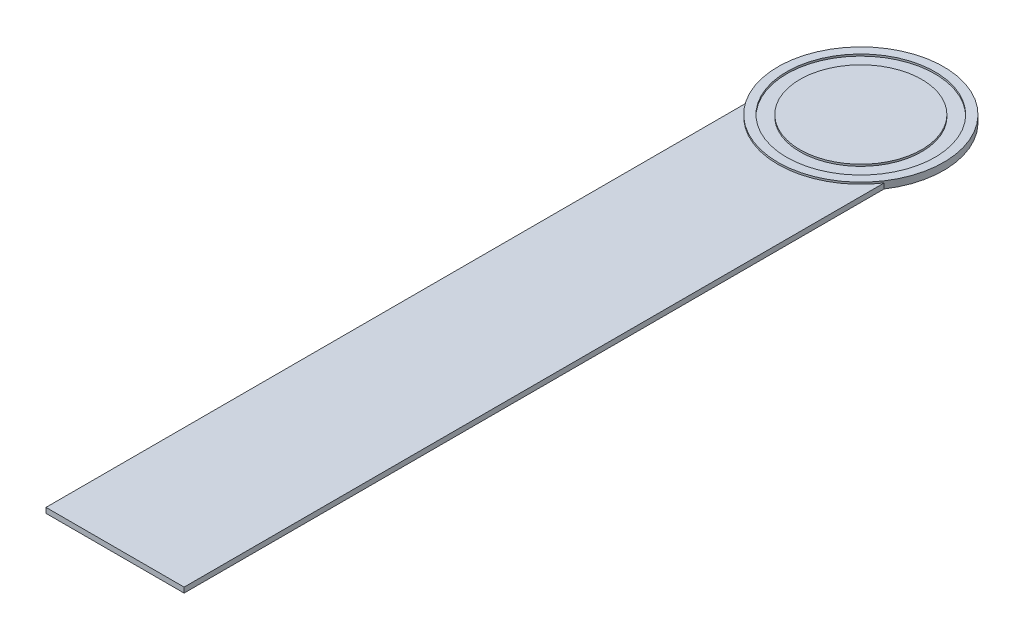
ISO-10303-21;
HEADER;
FILE_DESCRIPTION(('STEP AP214'),'2;1');
FILE_NAME('part.step','',(''),(''),'','','');
FILE_SCHEMA(('AUTOMOTIVE_DESIGN { 1 0 10303 214 1 1 1 1 }'));
ENDSEC;
DATA;
#1=APPLICATION_CONTEXT('core data for automotive mechanical design processes');
#2=APPLICATION_PROTOCOL_DEFINITION('international standard','automotive_design',2000,#1);
#3=PRODUCT_CONTEXT('',#1,'mechanical');
#4=PRODUCT('Part','Part','',(#3));
#5=PRODUCT_RELATED_PRODUCT_CATEGORY('part','',(#4));
#6=PRODUCT_DEFINITION_FORMATION('','',#4);
#7=PRODUCT_DEFINITION_CONTEXT('part definition',#1,'design');
#8=PRODUCT_DEFINITION('design','',#6,#7);
#9=PRODUCT_DEFINITION_SHAPE('','',#8);
#10=(LENGTH_UNIT() NAMED_UNIT(*) SI_UNIT(.MILLI.,.METRE.));
#11=(NAMED_UNIT(*) PLANE_ANGLE_UNIT() SI_UNIT($,.RADIAN.));
#12=(NAMED_UNIT(*) SI_UNIT($,.STERADIAN.) SOLID_ANGLE_UNIT());
#13=UNCERTAINTY_MEASURE_WITH_UNIT(LENGTH_MEASURE(1.E-05),#10,'distance_accuracy_value','');
#14=(GEOMETRIC_REPRESENTATION_CONTEXT(3) GLOBAL_UNCERTAINTY_ASSIGNED_CONTEXT((#13)) GLOBAL_UNIT_ASSIGNED_CONTEXT((#10,
#11,#12)) REPRESENTATION_CONTEXT('',''));
#15=CARTESIAN_POINT('',(0.,0.,0.));
#16=DIRECTION('',(0.,0.,1.));
#17=DIRECTION('',(1.,0.,0.));
#18=AXIS2_PLACEMENT_3D('',#15,#16,#17);
#19=CARTESIAN_POINT('',(0.,0.325,0.));
#20=DIRECTION('',(0.,-1.,0.));
#21=DIRECTION('',(0.,0.,-1.));
#22=AXIS2_PLACEMENT_3D('',#19,#20,#21);
#23=CYLINDRICAL_SURFACE('',#22,2.8);
#24=CARTESIAN_POINT('',(0.,0.24,0.));
#25=DIRECTION('',(0.,1.,0.));
#26=DIRECTION('',(0.,0.,1.));
#27=AXIS2_PLACEMENT_3D('',#24,#25,#26);
#28=CIRCLE('',#27,2.8);
#29=CARTESIAN_POINT('',(0.,0.24,2.8));
#30=VERTEX_POINT('',#29);
#31=EDGE_CURVE('E71',#30,#30,#28,.T.);
#32=ORIENTED_EDGE('',*,*,#31,.T.);
#33=EDGE_LOOP('',(#32));
#34=FACE_BOUND('',#33,.T.);
#35=CARTESIAN_POINT('',(0.,0.325,0.));
#36=DIRECTION('',(0.,1.,0.));
#37=DIRECTION('',(0.,0.,1.));
#38=AXIS2_PLACEMENT_3D('',#35,#36,#37);
#39=CIRCLE('',#38,2.8);
#40=CARTESIAN_POINT('',(0.,0.325,2.8));
#41=VERTEX_POINT('',#40);
#42=EDGE_CURVE('E12',#41,#41,#39,.T.);
#43=ORIENTED_EDGE('',*,*,#42,.F.);
#44=EDGE_LOOP('',(#43));
#45=FACE_BOUND('',#44,.T.);
#46=ADVANCED_FACE('F64',(#34,#45),#23,.T.);
#47=CARTESIAN_POINT('',(0.,0.325,0.));
#48=DIRECTION('',(0.,1.,0.));
#49=DIRECTION('',(0.,0.,1.));
#50=AXIS2_PLACEMENT_3D('',#47,#48,#49);
#51=PLANE('',#50);
#52=ORIENTED_EDGE('',*,*,#42,.T.);
#53=EDGE_LOOP('',(#52));
#54=FACE_BOUND('',#53,.T.);
#55=ADVANCED_FACE('F156',(#54),#51,.T.);
#56=CARTESIAN_POINT('',(0.,0.24,0.));
#57=DIRECTION('',(0.,1.,0.));
#58=DIRECTION('',(0.,0.,1.));
#59=AXIS2_PLACEMENT_3D('',#56,#57,#58);
#60=PLANE('',#59);
#61=CARTESIAN_POINT('',(0.,0.24,0.));
#62=DIRECTION('',(0.,1.,0.));
#63=DIRECTION('',(0.,0.,1.));
#64=AXIS2_PLACEMENT_3D('',#61,#62,#63);
#65=CIRCLE('',#64,3.41);
#66=CARTESIAN_POINT('',(0.,0.24,3.41));
#67=VERTEX_POINT('',#66);
#68=EDGE_CURVE('E145',#67,#67,#65,.F.);
#69=ORIENTED_EDGE('',*,*,#68,.F.);
#70=EDGE_LOOP('',(#69));
#71=FACE_BOUND('',#70,.T.);
#72=ORIENTED_EDGE('',*,*,#31,.F.);
#73=EDGE_LOOP('',(#72));
#74=FACE_BOUND('',#73,.T.);
#75=ADVANCED_FACE('F153',(#71,#74),#60,.T.);
#76=CARTESIAN_POINT('',(0.,0.325,0.));
#77=DIRECTION('',(0.,-1.,0.));
#78=DIRECTION('',(0.,0.,-1.));
#79=AXIS2_PLACEMENT_3D('',#76,#77,#78);
#80=CYLINDRICAL_SURFACE('',#79,3.81);
#81=CARTESIAN_POINT('',(0.,0.24,0.));
#82=DIRECTION('',(0.,1.,0.));
#83=DIRECTION('',(0.,0.,1.));
#84=AXIS2_PLACEMENT_3D('',#81,#82,#83);
#85=CIRCLE('',#84,3.81);
#86=CARTESIAN_POINT('',(-3.175,0.24,2.10605674187568));
#87=VERTEX_POINT('',#86);
#88=CARTESIAN_POINT('',(3.175,0.24,2.10605674187568));
#89=VERTEX_POINT('',#88);
#90=EDGE_CURVE('E78',#87,#89,#85,.T.);
#91=ORIENTED_EDGE('',*,*,#90,.T.);
#92=DIRECTION('',(0.,-1.,0.));
#93=VECTOR('',#92,1.);
#94=CARTESIAN_POINT('',(3.175,0.24,2.10605674187568));
#95=LINE('',#94,#93);
#96=CARTESIAN_POINT('',(3.175,0.,2.10605674187568));
#97=VERTEX_POINT('',#96);
#98=EDGE_CURVE('E115',#89,#97,#95,.T.);
#99=ORIENTED_EDGE('',*,*,#98,.T.);
#100=CARTESIAN_POINT('',(0.,0.,0.));
#101=DIRECTION('',(0.,1.,0.));
#102=DIRECTION('',(0.,0.,1.));
#103=AXIS2_PLACEMENT_3D('',#100,#101,#102);
#104=CIRCLE('',#103,3.81);
#105=CARTESIAN_POINT('',(-3.175,0.,2.10605674187568));
#106=VERTEX_POINT('',#105);
#107=EDGE_CURVE('E114',#97,#106,#104,.T.);
#108=ORIENTED_EDGE('',*,*,#107,.T.);
#109=DIRECTION('',(0.,-1.,0.));
#110=VECTOR('',#109,1.);
#111=CARTESIAN_POINT('',(-3.175,0.24,2.10605674187568));
#112=LINE('',#111,#110);
#113=EDGE_CURVE('E83',#87,#106,#112,.T.);
#114=ORIENTED_EDGE('',*,*,#113,.F.);
#115=EDGE_LOOP('',(#91,#99,#108,#114));
#116=FACE_BOUND('',#115,.T.);
#117=CARTESIAN_POINT('',(0.,0.325,0.));
#118=DIRECTION('',(0.,1.,0.));
#119=DIRECTION('',(0.,0.,1.));
#120=AXIS2_PLACEMENT_3D('',#117,#118,#119);
#121=CIRCLE('',#120,3.81);
#122=CARTESIAN_POINT('',(0.,0.325,3.81));
#123=VERTEX_POINT('',#122);
#124=EDGE_CURVE('E139',#123,#123,#121,.T.);
#125=ORIENTED_EDGE('',*,*,#124,.F.);
#126=EDGE_LOOP('',(#125));
#127=FACE_BOUND('',#126,.T.);
#128=ADVANCED_FACE('F155',(#116,#127),#80,.T.);
#129=CARTESIAN_POINT('',(0.,0.325,0.));
#130=DIRECTION('',(0.,-1.,0.));
#131=DIRECTION('',(0.,0.,-1.));
#132=AXIS2_PLACEMENT_3D('',#129,#130,#131);
#133=CYLINDRICAL_SURFACE('',#132,3.41);
#134=ORIENTED_EDGE('',*,*,#68,.T.);
#135=EDGE_LOOP('',(#134));
#136=FACE_BOUND('',#135,.T.);
#137=CARTESIAN_POINT('',(0.,0.325,0.));
#138=DIRECTION('',(0.,1.,0.));
#139=DIRECTION('',(0.,0.,1.));
#140=AXIS2_PLACEMENT_3D('',#137,#138,#139);
#141=CIRCLE('',#140,3.41);
#142=CARTESIAN_POINT('',(0.,0.325,3.41));
#143=VERTEX_POINT('',#142);
#144=EDGE_CURVE('E142',#143,#143,#141,.T.);
#145=ORIENTED_EDGE('',*,*,#144,.T.);
#146=EDGE_LOOP('',(#145));
#147=FACE_BOUND('',#146,.T.);
#148=ADVANCED_FACE('F163',(#136,#147),#133,.F.);
#149=CARTESIAN_POINT('',(0.,0.325,0.));
#150=DIRECTION('',(0.,1.,0.));
#151=DIRECTION('',(0.,0.,1.));
#152=AXIS2_PLACEMENT_3D('',#149,#150,#151);
#153=PLANE('',#152);
#154=ORIENTED_EDGE('',*,*,#124,.T.);
#155=EDGE_LOOP('',(#154));
#156=FACE_BOUND('',#155,.T.);
#157=ORIENTED_EDGE('',*,*,#144,.F.);
#158=EDGE_LOOP('',(#157));
#159=FACE_BOUND('',#158,.T.);
#160=ADVANCED_FACE('F188',(#156,#159),#153,.T.);
#161=CARTESIAN_POINT('',(0.,0.,0.));
#162=DIRECTION('',(0.,1.,0.));
#163=DIRECTION('',(0.,0.,1.));
#164=AXIS2_PLACEMENT_3D('',#161,#162,#163);
#165=PLANE('',#164);
#166=ORIENTED_EDGE('',*,*,#107,.F.);
#167=DIRECTION('',(0.,0.,1.));
#168=VECTOR('',#167,1.);
#169=CARTESIAN_POINT('',(3.175,0.,0.));
#170=LINE('',#169,#168);
#171=CARTESIAN_POINT('',(3.175,0.,34.29));
#172=VERTEX_POINT('',#171);
#173=EDGE_CURVE('E132',#97,#172,#170,.T.);
#174=ORIENTED_EDGE('',*,*,#173,.T.);
#175=DIRECTION('',(-1.,0.,0.));
#176=VECTOR('',#175,1.);
#177=CARTESIAN_POINT('',(0.,0.,34.29));
#178=LINE('',#177,#176);
#179=CARTESIAN_POINT('',(-3.175,0.,34.29));
#180=VERTEX_POINT('',#179);
#181=EDGE_CURVE('E109',#172,#180,#178,.T.);
#182=ORIENTED_EDGE('',*,*,#181,.T.);
#183=DIRECTION('',(0.,0.,1.));
#184=VECTOR('',#183,1.);
#185=CARTESIAN_POINT('',(-3.175,0.,0.));
#186=LINE('',#185,#184);
#187=EDGE_CURVE('E123',#106,#180,#186,.T.);
#188=ORIENTED_EDGE('',*,*,#187,.F.);
#189=EDGE_LOOP('',(#166,#174,#182,#188));
#190=FACE_BOUND('',#189,.T.);
#191=ADVANCED_FACE('F182',(#190),#165,.F.);
#192=CARTESIAN_POINT('',(0.,0.24,34.29));
#193=DIRECTION('',(0.,0.,1.));
#194=DIRECTION('',(1.,0.,0.));
#195=AXIS2_PLACEMENT_3D('',#192,#193,#194);
#196=PLANE('',#195);
#197=ORIENTED_EDGE('',*,*,#181,.F.);
#198=DIRECTION('',(0.,-1.,0.));
#199=VECTOR('',#198,1.);
#200=CARTESIAN_POINT('',(3.175,0.24,34.29));
#201=LINE('',#200,#199);
#202=CARTESIAN_POINT('',(3.175,0.24,34.29));
#203=VERTEX_POINT('',#202);
#204=EDGE_CURVE('E104',#203,#172,#201,.T.);
#205=ORIENTED_EDGE('',*,*,#204,.F.);
#206=DIRECTION('',(-1.,0.,0.));
#207=VECTOR('',#206,1.);
#208=CARTESIAN_POINT('',(0.,0.24,34.29));
#209=LINE('',#208,#207);
#210=CARTESIAN_POINT('',(-3.175,0.24,34.29));
#211=VERTEX_POINT('',#210);
#212=EDGE_CURVE('E107',#203,#211,#209,.T.);
#213=ORIENTED_EDGE('',*,*,#212,.T.);
#214=DIRECTION('',(0.,-1.,0.));
#215=VECTOR('',#214,1.);
#216=CARTESIAN_POINT('',(-3.175,0.24,34.29));
#217=LINE('',#216,#215);
#218=EDGE_CURVE('E130',#211,#180,#217,.T.);
#219=ORIENTED_EDGE('',*,*,#218,.T.);
#220=EDGE_LOOP('',(#197,#205,#213,#219));
#221=FACE_BOUND('',#220,.T.);
#222=ADVANCED_FACE('F106',(#221),#196,.T.);
#223=CARTESIAN_POINT('',(3.175,0.24,0.));
#224=DIRECTION('',(1.,0.,0.));
#225=DIRECTION('',(0.,0.,-1.));
#226=AXIS2_PLACEMENT_3D('',#223,#224,#225);
#227=PLANE('',#226);
#228=ORIENTED_EDGE('',*,*,#173,.F.);
#229=ORIENTED_EDGE('',*,*,#98,.F.);
#230=DIRECTION('',(0.,0.,1.));
#231=VECTOR('',#230,1.);
#232=CARTESIAN_POINT('',(3.175,0.24,0.));
#233=LINE('',#232,#231);
#234=EDGE_CURVE('E120',#89,#203,#233,.T.);
#235=ORIENTED_EDGE('',*,*,#234,.T.);
#236=ORIENTED_EDGE('',*,*,#204,.T.);
#237=EDGE_LOOP('',(#228,#229,#235,#236));
#238=FACE_BOUND('',#237,.T.);
#239=ADVANCED_FACE('F125',(#238),#227,.T.);
#240=CARTESIAN_POINT('',(-3.175,0.24,0.));
#241=DIRECTION('',(1.,0.,0.));
#242=DIRECTION('',(0.,0.,-1.));
#243=AXIS2_PLACEMENT_3D('',#240,#241,#242);
#244=PLANE('',#243);
#245=ORIENTED_EDGE('',*,*,#187,.T.);
#246=ORIENTED_EDGE('',*,*,#218,.F.);
#247=DIRECTION('',(0.,0.,1.));
#248=VECTOR('',#247,1.);
#249=CARTESIAN_POINT('',(-3.175,0.24,0.));
#250=LINE('',#249,#248);
#251=EDGE_CURVE('E121',#87,#211,#250,.T.);
#252=ORIENTED_EDGE('',*,*,#251,.F.);
#253=ORIENTED_EDGE('',*,*,#113,.T.);
#254=EDGE_LOOP('',(#245,#246,#252,#253));
#255=FACE_BOUND('',#254,.T.);
#256=ADVANCED_FACE('F232',(#255),#244,.F.);
#257=CARTESIAN_POINT('',(0.,0.24,0.));
#258=DIRECTION('',(0.,1.,0.));
#259=DIRECTION('',(0.,0.,1.));
#260=AXIS2_PLACEMENT_3D('',#257,#258,#259);
#261=PLANE('',#260);
#262=ORIENTED_EDGE('',*,*,#212,.F.);
#263=ORIENTED_EDGE('',*,*,#234,.F.);
#264=ORIENTED_EDGE('',*,*,#90,.F.);
#265=ORIENTED_EDGE('',*,*,#251,.T.);
#266=EDGE_LOOP('',(#262,#263,#264,#265));
#267=FACE_BOUND('',#266,.T.);
#268=ADVANCED_FACE('F119',(#267),#261,.T.);
#269=CLOSED_SHELL('',(#46,#55,#75,#128,#148,#160,#191,#222,#239,#256,#268));
#270=MANIFOLD_SOLID_BREP('B2',#269);
#271=ADVANCED_BREP_SHAPE_REPRESENTATION('',(#18,#270),#14);
#272=SHAPE_DEFINITION_REPRESENTATION(#9,#271);
ENDSEC;
END-ISO-10303-21;
